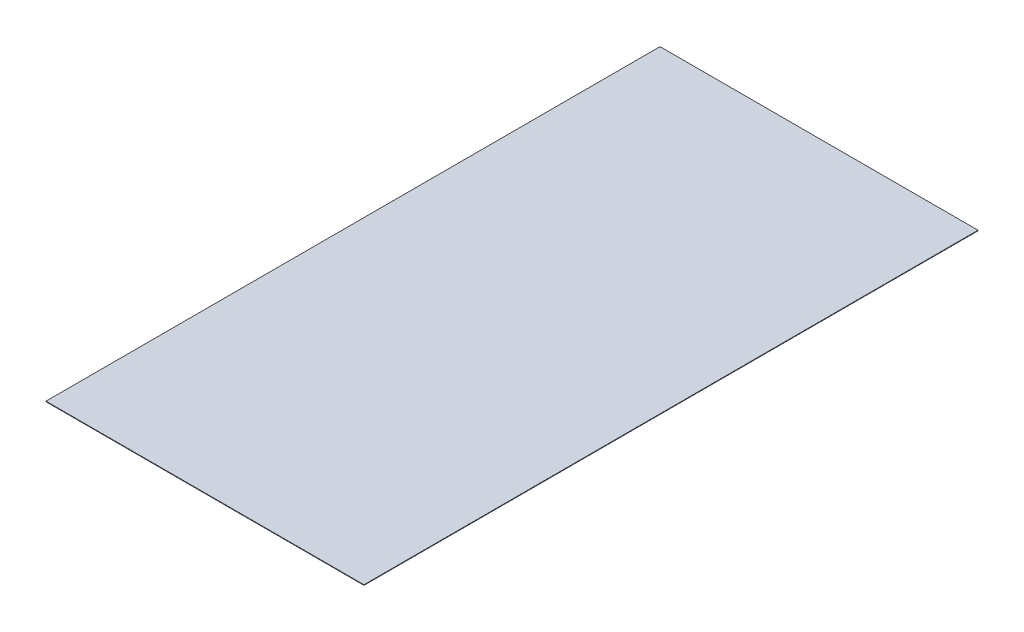
ISO-10303-21;
HEADER;
FILE_DESCRIPTION(('STEP AP214'),'2;1');
FILE_NAME('part.step','',(''),(''),'','','');
FILE_SCHEMA(('AUTOMOTIVE_DESIGN { 1 0 10303 214 1 1 1 1 }'));
ENDSEC;
DATA;
#1=APPLICATION_CONTEXT('core data for automotive mechanical design processes');
#2=APPLICATION_PROTOCOL_DEFINITION('international standard','automotive_design',2000,#1);
#3=PRODUCT_CONTEXT('',#1,'mechanical');
#4=PRODUCT('Part','Part','',(#3));
#5=PRODUCT_RELATED_PRODUCT_CATEGORY('part','',(#4));
#6=PRODUCT_DEFINITION_FORMATION('','',#4);
#7=PRODUCT_DEFINITION_CONTEXT('part definition',#1,'design');
#8=PRODUCT_DEFINITION('design','',#6,#7);
#9=PRODUCT_DEFINITION_SHAPE('','',#8);
#10=(LENGTH_UNIT() NAMED_UNIT(*) SI_UNIT(.MILLI.,.METRE.));
#11=(NAMED_UNIT(*) PLANE_ANGLE_UNIT() SI_UNIT($,.RADIAN.));
#12=(NAMED_UNIT(*) SI_UNIT($,.STERADIAN.) SOLID_ANGLE_UNIT());
#13=UNCERTAINTY_MEASURE_WITH_UNIT(LENGTH_MEASURE(1.E-05),#10,'distance_accuracy_value','');
#14=(GEOMETRIC_REPRESENTATION_CONTEXT(3) GLOBAL_UNCERTAINTY_ASSIGNED_CONTEXT((#13)) GLOBAL_UNIT_ASSIGNED_CONTEXT((#10,
#11,#12)) REPRESENTATION_CONTEXT('',''));
#15=CARTESIAN_POINT('',(0.,0.,0.));
#16=DIRECTION('',(0.,0.,1.));
#17=DIRECTION('',(1.,0.,0.));
#18=AXIS2_PLACEMENT_3D('',#15,#16,#17);
#19=CARTESIAN_POINT('',(2900.,10.,-5600.));
#20=DIRECTION('',(-1.,0.,0.));
#21=DIRECTION('',(0.,0.,1.));
#22=AXIS2_PLACEMENT_3D('',#19,#20,#21);
#23=PLANE('',#22);
#24=DIRECTION('',(0.,0.,-1.));
#25=VECTOR('',#24,1.);
#26=CARTESIAN_POINT('',(2900.,0.,-5600.));
#27=LINE('',#26,#25);
#28=CARTESIAN_POINT('',(2900.,0.,5600.));
#29=VERTEX_POINT('',#28);
#30=CARTESIAN_POINT('',(2900.,0.,-5600.));
#31=VERTEX_POINT('',#30);
#32=EDGE_CURVE('E95',#29,#31,#27,.T.);
#33=ORIENTED_EDGE('',*,*,#32,.T.);
#34=DIRECTION('',(0.,-1.,0.));
#35=VECTOR('',#34,1.);
#36=CARTESIAN_POINT('',(2900.,10.,-5600.));
#37=LINE('',#36,#35);
#38=CARTESIAN_POINT('',(2900.,10.,-5600.));
#39=VERTEX_POINT('',#38);
#40=EDGE_CURVE('E11',#39,#31,#37,.T.);
#41=ORIENTED_EDGE('',*,*,#40,.F.);
#42=DIRECTION('',(0.,0.,-1.));
#43=VECTOR('',#42,1.);
#44=CARTESIAN_POINT('',(2900.,10.,-5600.));
#45=LINE('',#44,#43);
#46=CARTESIAN_POINT('',(2900.,10.,5600.));
#47=VERTEX_POINT('',#46);
#48=EDGE_CURVE('E83',#47,#39,#45,.T.);
#49=ORIENTED_EDGE('',*,*,#48,.F.);
#50=DIRECTION('',(0.,-1.,0.));
#51=VECTOR('',#50,1.);
#52=CARTESIAN_POINT('',(2900.,10.,5600.));
#53=LINE('',#52,#51);
#54=EDGE_CURVE('E91',#47,#29,#53,.T.);
#55=ORIENTED_EDGE('',*,*,#54,.T.);
#56=EDGE_LOOP('',(#33,#41,#49,#55));
#57=FACE_BOUND('',#56,.T.);
#58=ADVANCED_FACE('F32',(#57),#23,.F.);
#59=CARTESIAN_POINT('',(-2900.,10.,-5600.));
#60=DIRECTION('',(0.,0.,1.));
#61=DIRECTION('',(1.,0.,0.));
#62=AXIS2_PLACEMENT_3D('',#59,#60,#61);
#63=PLANE('',#62);
#64=DIRECTION('',(-1.,0.,0.));
#65=VECTOR('',#64,1.);
#66=CARTESIAN_POINT('',(-2900.,0.,-5600.));
#67=LINE('',#66,#65);
#68=CARTESIAN_POINT('',(-2900.,0.,-5600.));
#69=VERTEX_POINT('',#68);
#70=EDGE_CURVE('E87',#31,#69,#67,.T.);
#71=ORIENTED_EDGE('',*,*,#70,.T.);
#72=DIRECTION('',(0.,-1.,0.));
#73=VECTOR('',#72,1.);
#74=CARTESIAN_POINT('',(-2900.,10.,-5600.));
#75=LINE('',#74,#73);
#76=CARTESIAN_POINT('',(-2900.,10.,-5600.));
#77=VERTEX_POINT('',#76);
#78=EDGE_CURVE('E40',#77,#69,#75,.T.);
#79=ORIENTED_EDGE('',*,*,#78,.F.);
#80=DIRECTION('',(-1.,0.,0.));
#81=VECTOR('',#80,1.);
#82=CARTESIAN_POINT('',(-2900.,10.,-5600.));
#83=LINE('',#82,#81);
#84=EDGE_CURVE('E78',#39,#77,#83,.T.);
#85=ORIENTED_EDGE('',*,*,#84,.F.);
#86=ORIENTED_EDGE('',*,*,#40,.T.);
#87=EDGE_LOOP('',(#71,#79,#85,#86));
#88=FACE_BOUND('',#87,.T.);
#89=ADVANCED_FACE('F86',(#88),#63,.F.);
#90=CARTESIAN_POINT('',(-2900.,10.,-5600.));
#91=DIRECTION('',(1.,0.,0.));
#92=DIRECTION('',(0.,0.,-1.));
#93=AXIS2_PLACEMENT_3D('',#90,#91,#92);
#94=PLANE('',#93);
#95=DIRECTION('',(0.,0.,1.));
#96=VECTOR('',#95,1.);
#97=CARTESIAN_POINT('',(-2900.,0.,-5600.));
#98=LINE('',#97,#96);
#99=CARTESIAN_POINT('',(-2900.,0.,5600.));
#100=VERTEX_POINT('',#99);
#101=EDGE_CURVE('E65',#69,#100,#98,.T.);
#102=ORIENTED_EDGE('',*,*,#101,.T.);
#103=DIRECTION('',(0.,-1.,0.));
#104=VECTOR('',#103,1.);
#105=CARTESIAN_POINT('',(-2900.,10.,5600.));
#106=LINE('',#105,#104);
#107=CARTESIAN_POINT('',(-2900.,10.,5600.));
#108=VERTEX_POINT('',#107);
#109=EDGE_CURVE('E88',#108,#100,#106,.T.);
#110=ORIENTED_EDGE('',*,*,#109,.F.);
#111=DIRECTION('',(0.,0.,1.));
#112=VECTOR('',#111,1.);
#113=CARTESIAN_POINT('',(-2900.,10.,-5600.));
#114=LINE('',#113,#112);
#115=EDGE_CURVE('E81',#77,#108,#114,.T.);
#116=ORIENTED_EDGE('',*,*,#115,.F.);
#117=ORIENTED_EDGE('',*,*,#78,.T.);
#118=EDGE_LOOP('',(#102,#110,#116,#117));
#119=FACE_BOUND('',#118,.T.);
#120=ADVANCED_FACE('F89',(#119),#94,.F.);
#121=CARTESIAN_POINT('',(-2900.,10.,5600.));
#122=DIRECTION('',(0.,0.,-1.));
#123=DIRECTION('',(-1.,0.,0.));
#124=AXIS2_PLACEMENT_3D('',#121,#122,#123);
#125=PLANE('',#124);
#126=DIRECTION('',(1.,0.,0.));
#127=VECTOR('',#126,1.);
#128=CARTESIAN_POINT('',(-2900.,0.,5600.));
#129=LINE('',#128,#127);
#130=EDGE_CURVE('E71',#100,#29,#129,.T.);
#131=ORIENTED_EDGE('',*,*,#130,.T.);
#132=ORIENTED_EDGE('',*,*,#54,.F.);
#133=DIRECTION('',(1.,0.,0.));
#134=VECTOR('',#133,1.);
#135=CARTESIAN_POINT('',(-2900.,10.,5600.));
#136=LINE('',#135,#134);
#137=EDGE_CURVE('E48',#108,#47,#136,.T.);
#138=ORIENTED_EDGE('',*,*,#137,.F.);
#139=ORIENTED_EDGE('',*,*,#109,.T.);
#140=EDGE_LOOP('',(#131,#132,#138,#139));
#141=FACE_BOUND('',#140,.T.);
#142=ADVANCED_FACE('F102',(#141),#125,.F.);
#143=CARTESIAN_POINT('',(0.,10.,0.));
#144=DIRECTION('',(0.,1.,0.));
#145=DIRECTION('',(0.,0.,1.));
#146=AXIS2_PLACEMENT_3D('',#143,#144,#145);
#147=PLANE('',#146);
#148=ORIENTED_EDGE('',*,*,#48,.T.);
#149=ORIENTED_EDGE('',*,*,#84,.T.);
#150=ORIENTED_EDGE('',*,*,#115,.T.);
#151=ORIENTED_EDGE('',*,*,#137,.T.);
#152=EDGE_LOOP('',(#148,#149,#150,#151));
#153=FACE_BOUND('',#152,.T.);
#154=ADVANCED_FACE('F79',(#153),#147,.T.);
#155=CARTESIAN_POINT('',(0.,0.,0.));
#156=DIRECTION('',(0.,1.,0.));
#157=DIRECTION('',(0.,0.,1.));
#158=AXIS2_PLACEMENT_3D('',#155,#156,#157);
#159=PLANE('',#158);
#160=ORIENTED_EDGE('',*,*,#32,.F.);
#161=ORIENTED_EDGE('',*,*,#130,.F.);
#162=ORIENTED_EDGE('',*,*,#101,.F.);
#163=ORIENTED_EDGE('',*,*,#70,.F.);
#164=EDGE_LOOP('',(#160,#161,#162,#163));
#165=FACE_BOUND('',#164,.T.);
#166=ADVANCED_FACE('F105',(#165),#159,.F.);
#167=CLOSED_SHELL('',(#58,#89,#120,#142,#154,#166));
#168=MANIFOLD_SOLID_BREP('B2',#167);
#169=ADVANCED_BREP_SHAPE_REPRESENTATION('',(#18,#168),#14);
#170=SHAPE_DEFINITION_REPRESENTATION(#9,#169);
ENDSEC;
END-ISO-10303-21;
